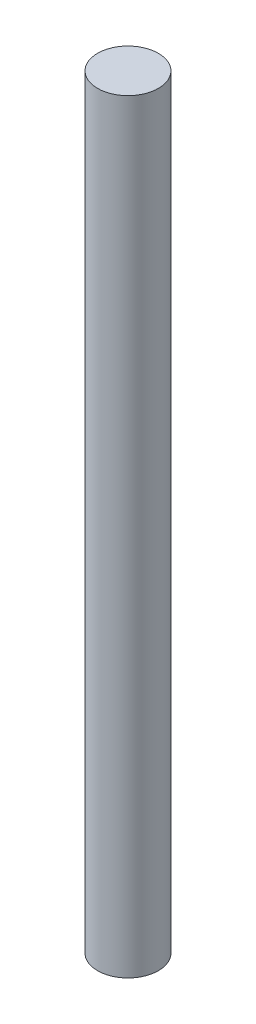
ISO-10303-21;
HEADER;
FILE_DESCRIPTION(('STEP AP214'),'2;1');
FILE_NAME('part.step','',(''),(''),'','','');
FILE_SCHEMA(('AUTOMOTIVE_DESIGN { 1 0 10303 214 1 1 1 1 }'));
ENDSEC;
DATA;
#1=APPLICATION_CONTEXT('core data for automotive mechanical design processes');
#2=APPLICATION_PROTOCOL_DEFINITION('international standard','automotive_design',2000,#1);
#3=PRODUCT_CONTEXT('',#1,'mechanical');
#4=PRODUCT('Part','Part','',(#3));
#5=PRODUCT_RELATED_PRODUCT_CATEGORY('part','',(#4));
#6=PRODUCT_DEFINITION_FORMATION('','',#4);
#7=PRODUCT_DEFINITION_CONTEXT('part definition',#1,'design');
#8=PRODUCT_DEFINITION('design','',#6,#7);
#9=PRODUCT_DEFINITION_SHAPE('','',#8);
#10=(LENGTH_UNIT() NAMED_UNIT(*) SI_UNIT(.MILLI.,.METRE.));
#11=(NAMED_UNIT(*) PLANE_ANGLE_UNIT() SI_UNIT($,.RADIAN.));
#12=(NAMED_UNIT(*) SI_UNIT($,.STERADIAN.) SOLID_ANGLE_UNIT());
#13=UNCERTAINTY_MEASURE_WITH_UNIT(LENGTH_MEASURE(1.E-05),#10,'distance_accuracy_value','');
#14=(GEOMETRIC_REPRESENTATION_CONTEXT(3) GLOBAL_UNCERTAINTY_ASSIGNED_CONTEXT((#13)) GLOBAL_UNIT_ASSIGNED_CONTEXT((#10,
#11,#12)) REPRESENTATION_CONTEXT('',''));
#15=CARTESIAN_POINT('',(0.,0.,0.));
#16=DIRECTION('',(0.,0.,1.));
#17=DIRECTION('',(1.,0.,0.));
#18=AXIS2_PLACEMENT_3D('',#15,#16,#17);
#19=CARTESIAN_POINT('',(0.,50.,0.));
#20=DIRECTION('',(0.,-1.,0.));
#21=DIRECTION('',(0.,0.,-1.));
#22=AXIS2_PLACEMENT_3D('',#19,#20,#21);
#23=CYLINDRICAL_SURFACE('',#22,1.99);
#24=CARTESIAN_POINT('',(0.,50.,0.));
#25=DIRECTION('',(0.,1.,0.));
#26=DIRECTION('',(0.,0.,1.));
#27=AXIS2_PLACEMENT_3D('',#24,#25,#26);
#28=CIRCLE('',#27,1.99);
#29=CARTESIAN_POINT('',(0.,50.,1.99));
#30=VERTEX_POINT('',#29);
#31=EDGE_CURVE('E10',#30,#30,#28,.T.);
#32=ORIENTED_EDGE('',*,*,#31,.F.);
#33=EDGE_LOOP('',(#32));
#34=FACE_BOUND('',#33,.T.);
#35=CARTESIAN_POINT('',(0.,0.,0.));
#36=DIRECTION('',(0.,1.,0.));
#37=DIRECTION('',(0.,0.,1.));
#38=AXIS2_PLACEMENT_3D('',#35,#36,#37);
#39=CIRCLE('',#38,1.99);
#40=CARTESIAN_POINT('',(0.,0.,1.99));
#41=VERTEX_POINT('',#40);
#42=EDGE_CURVE('E46',#41,#41,#39,.T.);
#43=ORIENTED_EDGE('',*,*,#42,.T.);
#44=EDGE_LOOP('',(#43));
#45=FACE_BOUND('',#44,.T.);
#46=ADVANCED_FACE('F43',(#34,#45),#23,.T.);
#47=CARTESIAN_POINT('',(0.,50.,0.));
#48=DIRECTION('',(0.,1.,0.));
#49=DIRECTION('',(0.,0.,1.));
#50=AXIS2_PLACEMENT_3D('',#47,#48,#49);
#51=PLANE('',#50);
#52=ORIENTED_EDGE('',*,*,#31,.T.);
#53=EDGE_LOOP('',(#52));
#54=FACE_BOUND('',#53,.T.);
#55=ADVANCED_FACE('F60',(#54),#51,.T.);
#56=CARTESIAN_POINT('',(0.,0.,0.));
#57=DIRECTION('',(0.,1.,0.));
#58=DIRECTION('',(0.,0.,1.));
#59=AXIS2_PLACEMENT_3D('',#56,#57,#58);
#60=PLANE('',#59);
#61=ORIENTED_EDGE('',*,*,#42,.F.);
#62=EDGE_LOOP('',(#61));
#63=FACE_BOUND('',#62,.T.);
#64=ADVANCED_FACE('F58',(#63),#60,.F.);
#65=CLOSED_SHELL('',(#46,#55,#64));
#66=MANIFOLD_SOLID_BREP('B2',#65);
#67=ADVANCED_BREP_SHAPE_REPRESENTATION('',(#18,#66),#14);
#68=SHAPE_DEFINITION_REPRESENTATION(#9,#67);
ENDSEC;
END-ISO-10303-21;
